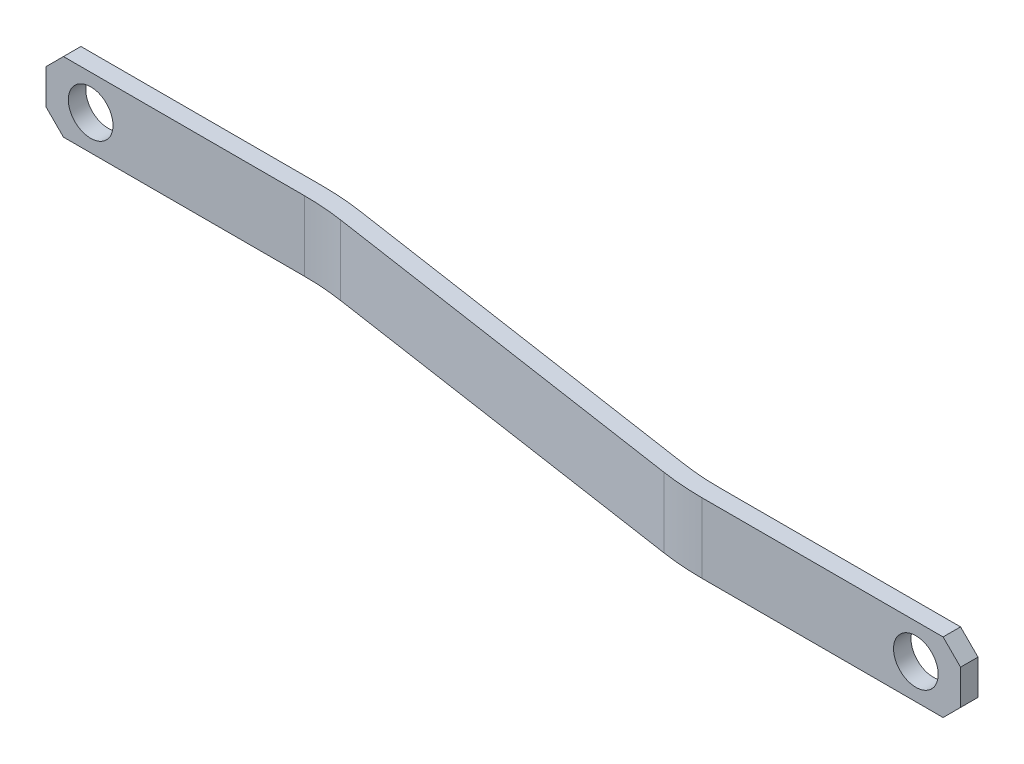
ISO-10303-21;
HEADER;
FILE_DESCRIPTION(('STEP AP214'),'2;1');
FILE_NAME('part.step','',(''),(''),'','','');
FILE_SCHEMA(('AUTOMOTIVE_DESIGN { 1 0 10303 214 1 1 1 1 }'));
ENDSEC;
DATA;
#1=APPLICATION_CONTEXT('core data for automotive mechanical design processes');
#2=APPLICATION_PROTOCOL_DEFINITION('international standard','automotive_design',2000,#1);
#3=PRODUCT_CONTEXT('',#1,'mechanical');
#4=PRODUCT('Part','Part','',(#3));
#5=PRODUCT_RELATED_PRODUCT_CATEGORY('part','',(#4));
#6=PRODUCT_DEFINITION_FORMATION('','',#4);
#7=PRODUCT_DEFINITION_CONTEXT('part definition',#1,'design');
#8=PRODUCT_DEFINITION('design','',#6,#7);
#9=PRODUCT_DEFINITION_SHAPE('','',#8);
#10=(LENGTH_UNIT() NAMED_UNIT(*) SI_UNIT(.MILLI.,.METRE.));
#11=(NAMED_UNIT(*) PLANE_ANGLE_UNIT() SI_UNIT($,.RADIAN.));
#12=(NAMED_UNIT(*) SI_UNIT($,.STERADIAN.) SOLID_ANGLE_UNIT());
#13=UNCERTAINTY_MEASURE_WITH_UNIT(LENGTH_MEASURE(1.E-05),#10,'distance_accuracy_value','');
#14=(GEOMETRIC_REPRESENTATION_CONTEXT(3) GLOBAL_UNCERTAINTY_ASSIGNED_CONTEXT((#13)) GLOBAL_UNIT_ASSIGNED_CONTEXT((#10,
#11,#12)) REPRESENTATION_CONTEXT('',''));
#15=CARTESIAN_POINT('',(0.,0.,0.));
#16=DIRECTION('',(0.,0.,1.));
#17=DIRECTION('',(1.,0.,0.));
#18=AXIS2_PLACEMENT_3D('',#15,#16,#17);
#19=CARTESIAN_POINT('',(47.0227665510806,-38.1,50.8));
#20=DIRECTION('',(0.,1.,0.));
#21=DIRECTION('',(-1.,0.,0.));
#22=AXIS2_PLACEMENT_3D('',#19,#20,#21);
#23=CYLINDRICAL_SURFACE('',#22,50.8);
#24=DIRECTION('',(0.,1.,0.));
#25=VECTOR('',#24,1.);
#26=CARTESIAN_POINT('',(54.5356969778409,-38.1,0.558623860381184));
#27=LINE('',#26,#25);
#28=CARTESIAN_POINT('',(54.5356969778409,0.,0.558623860381192));
#29=VERTEX_POINT('',#28);
#30=CARTESIAN_POINT('',(54.5356969778409,12.7,0.558623860381191));
#31=VERTEX_POINT('',#30);
#32=EDGE_CURVE('E265',#29,#31,#27,.T.);
#33=ORIENTED_EDGE('',*,*,#32,.F.);
#34=CARTESIAN_POINT('',(47.0227665510806,0.,50.8));
#35=DIRECTION('',(0.,1.,0.));
#36=DIRECTION('',(0.,0.,1.));
#37=AXIS2_PLACEMENT_3D('',#34,#35,#36);
#38=CIRCLE('',#37,50.8);
#39=CARTESIAN_POINT('',(47.0227665510806,0.,0.));
#40=VERTEX_POINT('',#39);
#41=EDGE_CURVE('E263',#29,#40,#38,.T.);
#42=ORIENTED_EDGE('',*,*,#41,.T.);
#43=DIRECTION('',(0.,1.,0.));
#44=VECTOR('',#43,1.);
#45=CARTESIAN_POINT('',(47.0227665510806,-38.1,0.));
#46=LINE('',#45,#44);
#47=CARTESIAN_POINT('',(47.0227665510806,12.7,0.));
#48=VERTEX_POINT('',#47);
#49=EDGE_CURVE('E184',#40,#48,#46,.T.);
#50=ORIENTED_EDGE('',*,*,#49,.T.);
#51=CARTESIAN_POINT('',(47.0227665510806,12.7,50.8));
#52=DIRECTION('',(0.,1.,0.));
#53=DIRECTION('',(1.,0.,0.));
#54=AXIS2_PLACEMENT_3D('',#51,#52,#53);
#55=CIRCLE('',#54,50.8);
#56=EDGE_CURVE('E230',#31,#48,#55,.T.);
#57=ORIENTED_EDGE('',*,*,#56,.F.);
#58=EDGE_LOOP('',(#33,#42,#50,#57));
#59=FACE_BOUND('',#58,.T.);
#60=ADVANCED_FACE('F41',(#59),#23,.T.);
#61=CARTESIAN_POINT('',(130.777233448919,-38.1,11.43));
#62=DIRECTION('',(0.,0.,-1.));
#63=DIRECTION('',(-1.,0.,0.));
#64=AXIS2_PLACEMENT_3D('',#61,#62,#63);
#65=PLANE('',#64);
#66=CARTESIAN_POINT('',(169.672,6.34999999999999,11.43));
#67=DIRECTION('',(0.,0.,1.));
#68=DIRECTION('',(1.,0.,0.));
#69=AXIS2_PLACEMENT_3D('',#66,#67,#68);
#70=CIRCLE('',#69,4.06399999999999);
#71=CARTESIAN_POINT('',(173.736,6.34999999999999,11.43));
#72=VERTEX_POINT('',#71);
#73=EDGE_CURVE('E301',#72,#72,#70,.T.);
#74=ORIENTED_EDGE('',*,*,#73,.T.);
#75=EDGE_LOOP('',(#74));
#76=FACE_BOUND('',#75,.T.);
#77=DIRECTION('',(-1.,0.,0.));
#78=VECTOR('',#77,1.);
#79=CARTESIAN_POINT('',(130.777233448919,12.7,11.43));
#80=LINE('',#79,#78);
#81=CARTESIAN_POINT('',(174.625,12.7,11.43));
#82=VERTEX_POINT('',#81);
#83=CARTESIAN_POINT('',(130.777233448919,12.7,11.43));
#84=VERTEX_POINT('',#83);
#85=EDGE_CURVE('E178',#82,#84,#80,.T.);
#86=ORIENTED_EDGE('',*,*,#85,.F.);
#87=DIRECTION('',(0.707106781186553,-0.707106781186542,0.));
#88=VECTOR('',#87,1.);
#89=CARTESIAN_POINT('',(178.101116724459,9.22388327554063,11.43));
#90=LINE('',#89,#88);
#91=CARTESIAN_POINT('',(177.8,9.52499999999996,11.43));
#92=VERTEX_POINT('',#91);
#93=EDGE_CURVE('E194',#82,#92,#90,.T.);
#94=ORIENTED_EDGE('',*,*,#93,.T.);
#95=DIRECTION('',(0.,1.,0.));
#96=VECTOR('',#95,1.);
#97=CARTESIAN_POINT('',(177.8,-38.1,11.43));
#98=LINE('',#97,#96);
#99=CARTESIAN_POINT('',(177.8,3.17500000000003,11.43));
#100=VERTEX_POINT('',#99);
#101=EDGE_CURVE('E273',#100,#92,#98,.T.);
#102=ORIENTED_EDGE('',*,*,#101,.F.);
#103=DIRECTION('',(-0.707106781186555,-0.70710678118654,0.));
#104=VECTOR('',#103,1.);
#105=CARTESIAN_POINT('',(133.651116724459,-40.9738832755398,11.43));
#106=LINE('',#105,#104);
#107=CARTESIAN_POINT('',(174.625,0.,11.43));
#108=VERTEX_POINT('',#107);
#109=EDGE_CURVE('E186',#100,#108,#106,.T.);
#110=ORIENTED_EDGE('',*,*,#109,.T.);
#111=DIRECTION('',(-1.,0.,0.));
#112=VECTOR('',#111,1.);
#113=CARTESIAN_POINT('',(0.,0.,11.43));
#114=LINE('',#113,#112);
#115=CARTESIAN_POINT('',(130.777233448919,0.,11.43));
#116=VERTEX_POINT('',#115);
#117=EDGE_CURVE('E252',#108,#116,#114,.T.);
#118=ORIENTED_EDGE('',*,*,#117,.T.);
#119=DIRECTION('',(0.,1.,0.));
#120=VECTOR('',#119,1.);
#121=CARTESIAN_POINT('',(130.777233448919,-38.1,11.43));
#122=LINE('',#121,#120);
#123=EDGE_CURVE('E276',#116,#84,#122,.T.);
#124=ORIENTED_EDGE('',*,*,#123,.T.);
#125=EDGE_LOOP('',(#86,#94,#102,#110,#118,#124));
#126=FACE_BOUND('',#125,.T.);
#127=ADVANCED_FACE('F325',(#76,#126),#65,.T.);
#128=CARTESIAN_POINT('',(130.777233448919,-38.1,-36.195));
#129=DIRECTION('',(0.,1.,0.));
#130=DIRECTION('',(-1.,0.,0.));
#131=AXIS2_PLACEMENT_3D('',#128,#129,#130);
#132=CYLINDRICAL_SURFACE('',#131,47.625);
#133=ORIENTED_EDGE('',*,*,#123,.F.);
#134=CARTESIAN_POINT('',(130.777233448919,0.,-36.195));
#135=DIRECTION('',(0.,1.,0.));
#136=DIRECTION('',(0.,0.,1.));
#137=AXIS2_PLACEMENT_3D('',#134,#135,#136);
#138=CIRCLE('',#137,47.625);
#139=CARTESIAN_POINT('',(123.733861173832,0.,10.9062901308926));
#140=VERTEX_POINT('',#139);
#141=EDGE_CURVE('E249',#116,#140,#138,.F.);
#142=ORIENTED_EDGE('',*,*,#141,.T.);
#143=DIRECTION('',(0.,1.,0.));
#144=VECTOR('',#143,1.);
#145=CARTESIAN_POINT('',(123.733861173832,-38.1,10.9062901308926));
#146=LINE('',#145,#144);
#147=CARTESIAN_POINT('',(123.733861173832,12.7,10.9062901308926));
#148=VERTEX_POINT('',#147);
#149=EDGE_CURVE('E279',#140,#148,#146,.T.);
#150=ORIENTED_EDGE('',*,*,#149,.T.);
#151=CARTESIAN_POINT('',(130.777233448919,12.7,-36.195));
#152=DIRECTION('',(0.,-1.,0.));
#153=DIRECTION('',(-1.,0.,0.));
#154=AXIS2_PLACEMENT_3D('',#151,#152,#153);
#155=CIRCLE('',#154,47.625);
#156=EDGE_CURVE('E287',#84,#148,#155,.T.);
#157=ORIENTED_EDGE('',*,*,#156,.F.);
#158=EDGE_LOOP('',(#133,#142,#150,#157));
#159=FACE_BOUND('',#158,.T.);
#160=ADVANCED_FACE('F331',(#159),#132,.F.);
#161=CARTESIAN_POINT('',(54.5356969778409,-38.1,0.558623860381191));
#162=DIRECTION('',(0.147892331235438,0.,-0.989003467315331));
#163=DIRECTION('',(-0.989003467315331,0.,-0.147892331235438));
#164=AXIS2_PLACEMENT_3D('',#161,#162,#163);
#165=PLANE('',#164);
#166=ORIENTED_EDGE('',*,*,#149,.F.);
#167=DIRECTION('',(-0.989003467315331,0.,-0.147892331235438));
#168=VECTOR('',#167,1.);
#169=CARTESIAN_POINT('',(3.24732013973059,0.,-7.11087161313806));
#170=LINE('',#169,#168);
#171=EDGE_CURVE('E241',#140,#29,#170,.T.);
#172=ORIENTED_EDGE('',*,*,#171,.T.);
#173=ORIENTED_EDGE('',*,*,#32,.T.);
#174=DIRECTION('',(-0.989003467315331,0.,-0.147892331235438));
#175=VECTOR('',#174,1.);
#176=CARTESIAN_POINT('',(54.5356969778409,12.7,0.558623860381191));
#177=LINE('',#176,#175);
#178=EDGE_CURVE('E285',#148,#31,#177,.T.);
#179=ORIENTED_EDGE('',*,*,#178,.F.);
#180=EDGE_LOOP('',(#166,#172,#173,#179));
#181=FACE_BOUND('',#180,.T.);
#182=ADVANCED_FACE('F339',(#181),#165,.T.);
#183=CARTESIAN_POINT('',(0.,0.,0.));
#184=DIRECTION('',(0.,0.,-1.));
#185=DIRECTION('',(-1.,0.,0.));
#186=AXIS2_PLACEMENT_3D('',#183,#184,#185);
#187=PLANE('',#186);
#188=CARTESIAN_POINT('',(8.128,6.35,0.));
#189=DIRECTION('',(0.,0.,1.));
#190=DIRECTION('',(1.,0.,0.));
#191=AXIS2_PLACEMENT_3D('',#188,#189,#190);
#192=CIRCLE('',#191,4.064);
#193=CARTESIAN_POINT('',(12.192,6.35,0.));
#194=VERTEX_POINT('',#193);
#195=EDGE_CURVE('E294',#194,#194,#192,.T.);
#196=ORIENTED_EDGE('',*,*,#195,.T.);
#197=EDGE_LOOP('',(#196));
#198=FACE_BOUND('',#197,.T.);
#199=DIRECTION('',(0.,1.,0.));
#200=VECTOR('',#199,1.);
#201=CARTESIAN_POINT('',(0.,0.,0.));
#202=LINE('',#201,#200);
#203=CARTESIAN_POINT('',(0.,3.17500000000002,0.));
#204=VERTEX_POINT('',#203);
#205=CARTESIAN_POINT('',(0.,9.52499999999998,0.));
#206=VERTEX_POINT('',#205);
#207=EDGE_CURVE('E238',#204,#206,#202,.T.);
#208=ORIENTED_EDGE('',*,*,#207,.T.);
#209=DIRECTION('',(0.707106781186556,0.707106781186539,0.));
#210=VECTOR('',#209,1.);
#211=CARTESIAN_POINT('',(-4.76249999999999,4.7625000000001,0.));
#212=LINE('',#211,#210);
#213=CARTESIAN_POINT('',(3.17500000000009,12.7,0.));
#214=VERTEX_POINT('',#213);
#215=EDGE_CURVE('E213',#206,#214,#212,.T.);
#216=ORIENTED_EDGE('',*,*,#215,.T.);
#217=DIRECTION('',(-1.,0.,0.));
#218=VECTOR('',#217,1.);
#219=CARTESIAN_POINT('',(177.8,12.7,0.));
#220=LINE('',#219,#218);
#221=EDGE_CURVE('E236',#48,#214,#220,.T.);
#222=ORIENTED_EDGE('',*,*,#221,.F.);
#223=ORIENTED_EDGE('',*,*,#49,.F.);
#224=DIRECTION('',(1.,0.,0.));
#225=VECTOR('',#224,1.);
#226=CARTESIAN_POINT('',(0.,0.,0.));
#227=LINE('',#226,#225);
#228=CARTESIAN_POINT('',(3.17500000000005,0.,0.));
#229=VERTEX_POINT('',#228);
#230=EDGE_CURVE('E168',#229,#40,#227,.T.);
#231=ORIENTED_EDGE('',*,*,#230,.F.);
#232=DIRECTION('',(-0.707106781186551,0.707106781186544,0.));
#233=VECTOR('',#232,1.);
#234=CARTESIAN_POINT('',(1.58750000000001,1.58750000000003,0.));
#235=LINE('',#234,#233);
#236=EDGE_CURVE('E211',#229,#204,#235,.T.);
#237=ORIENTED_EDGE('',*,*,#236,.T.);
#238=EDGE_LOOP('',(#208,#216,#222,#223,#231,#237));
#239=FACE_BOUND('',#238,.T.);
#240=ADVANCED_FACE('F234',(#198,#239),#187,.T.);
#241=CARTESIAN_POINT('',(0.,0.,14.605));
#242=DIRECTION('',(-1.,0.,0.));
#243=DIRECTION('',(0.,0.,1.));
#244=AXIS2_PLACEMENT_3D('',#241,#242,#243);
#245=PLANE('',#244);
#246=DIRECTION('',(0.,1.,0.));
#247=VECTOR('',#246,1.);
#248=CARTESIAN_POINT('',(0.,-38.1,3.175));
#249=LINE('',#248,#247);
#250=CARTESIAN_POINT('',(0.,3.17500000000003,3.175));
#251=VERTEX_POINT('',#250);
#252=CARTESIAN_POINT('',(0.,9.52499999999998,3.175));
#253=VERTEX_POINT('',#252);
#254=EDGE_CURVE('E219',#251,#253,#249,.T.);
#255=ORIENTED_EDGE('',*,*,#254,.T.);
#256=DIRECTION('',(0.,0.,-1.));
#257=VECTOR('',#256,1.);
#258=CARTESIAN_POINT('',(0.,9.52499999999998,0.));
#259=LINE('',#258,#257);
#260=EDGE_CURVE('E208',#253,#206,#259,.T.);
#261=ORIENTED_EDGE('',*,*,#260,.T.);
#262=ORIENTED_EDGE('',*,*,#207,.F.);
#263=DIRECTION('',(0.,0.,1.));
#264=VECTOR('',#263,1.);
#265=CARTESIAN_POINT('',(0.,3.17500000000002,3.175));
#266=LINE('',#265,#264);
#267=EDGE_CURVE('E206',#204,#251,#266,.T.);
#268=ORIENTED_EDGE('',*,*,#267,.T.);
#269=EDGE_LOOP('',(#255,#261,#262,#268));
#270=FACE_BOUND('',#269,.T.);
#271=ADVANCED_FACE('F225',(#270),#245,.T.);
#272=CARTESIAN_POINT('',(0.,0.,14.605));
#273=DIRECTION('',(0.,1.,0.));
#274=DIRECTION('',(0.,0.,1.));
#275=AXIS2_PLACEMENT_3D('',#272,#273,#274);
#276=PLANE('',#275);
#277=DIRECTION('',(1.,0.,0.));
#278=VECTOR('',#277,1.);
#279=CARTESIAN_POINT('',(0.,0.,3.175));
#280=LINE('',#279,#278);
#281=CARTESIAN_POINT('',(3.17500000000005,0.,3.175));
#282=VERTEX_POINT('',#281);
#283=CARTESIAN_POINT('',(47.0227665510805,0.,3.17499999999999));
#284=VERTEX_POINT('',#283);
#285=EDGE_CURVE('E260',#282,#284,#280,.T.);
#286=ORIENTED_EDGE('',*,*,#285,.F.);
#287=DIRECTION('',(0.,0.,-1.));
#288=VECTOR('',#287,1.);
#289=CARTESIAN_POINT('',(3.17500000000005,0.,0.));
#290=LINE('',#289,#288);
#291=EDGE_CURVE('E11',#282,#229,#290,.T.);
#292=ORIENTED_EDGE('',*,*,#291,.T.);
#293=ORIENTED_EDGE('',*,*,#230,.T.);
#294=ORIENTED_EDGE('',*,*,#41,.F.);
#295=ORIENTED_EDGE('',*,*,#171,.F.);
#296=ORIENTED_EDGE('',*,*,#141,.F.);
#297=ORIENTED_EDGE('',*,*,#117,.F.);
#298=DIRECTION('',(0.,0.,1.));
#299=VECTOR('',#298,1.);
#300=CARTESIAN_POINT('',(174.625,0.,14.605));
#301=LINE('',#300,#299);
#302=CARTESIAN_POINT('',(174.625,0.,14.605));
#303=VERTEX_POINT('',#302);
#304=EDGE_CURVE('E204',#108,#303,#301,.T.);
#305=ORIENTED_EDGE('',*,*,#304,.T.);
#306=DIRECTION('',(1.,0.,0.));
#307=VECTOR('',#306,1.);
#308=CARTESIAN_POINT('',(0.,0.,14.605));
#309=LINE('',#308,#307);
#310=CARTESIAN_POINT('',(130.777233448919,0.,14.605));
#311=VERTEX_POINT('',#310);
#312=EDGE_CURVE('E189',#311,#303,#309,.T.);
#313=ORIENTED_EDGE('',*,*,#312,.F.);
#314=CARTESIAN_POINT('',(130.777233448919,0.,-36.195));
#315=DIRECTION('',(0.,1.,0.));
#316=DIRECTION('',(0.,0.,1.));
#317=AXIS2_PLACEMENT_3D('',#314,#315,#316);
#318=CIRCLE('',#317,50.8);
#319=CARTESIAN_POINT('',(123.264303022159,0.,14.0463761396188));
#320=VERTEX_POINT('',#319);
#321=EDGE_CURVE('E182',#320,#311,#318,.T.);
#322=ORIENTED_EDGE('',*,*,#321,.F.);
#323=DIRECTION('',(0.989003467315331,0.,0.147892331235439));
#324=VECTOR('',#323,1.);
#325=CARTESIAN_POINT('',(2.77776198805809,0.,-3.97078560441192));
#326=LINE('',#325,#324);
#327=CARTESIAN_POINT('',(54.0661388261683,0.,3.69870986910734));
#328=VERTEX_POINT('',#327);
#329=EDGE_CURVE('E254',#328,#320,#326,.T.);
#330=ORIENTED_EDGE('',*,*,#329,.F.);
#331=CARTESIAN_POINT('',(47.0227665510805,0.,50.8));
#332=DIRECTION('',(0.,1.,0.));
#333=DIRECTION('',(0.,0.,1.));
#334=AXIS2_PLACEMENT_3D('',#331,#332,#333);
#335=CIRCLE('',#334,47.625);
#336=EDGE_CURVE('E257',#284,#328,#335,.F.);
#337=ORIENTED_EDGE('',*,*,#336,.F.);
#338=EDGE_LOOP('',(#286,#292,#293,#294,#295,#296,#297,#305,#313,#322,#330,#337));
#339=FACE_BOUND('',#338,.T.);
#340=ADVANCED_FACE('F368',(#339),#276,.F.);
#341=CARTESIAN_POINT('',(177.8,12.7,14.605));
#342=DIRECTION('',(1.,0.,0.));
#343=DIRECTION('',(0.,0.,-1.));
#344=AXIS2_PLACEMENT_3D('',#341,#342,#343);
#345=PLANE('',#344);
#346=ORIENTED_EDGE('',*,*,#101,.T.);
#347=DIRECTION('',(0.,0.,1.));
#348=VECTOR('',#347,1.);
#349=CARTESIAN_POINT('',(177.8,9.52499999999996,14.605));
#350=LINE('',#349,#348);
#351=CARTESIAN_POINT('',(177.8,9.52499999999996,14.605));
#352=VERTEX_POINT('',#351);
#353=EDGE_CURVE('E199',#92,#352,#350,.T.);
#354=ORIENTED_EDGE('',*,*,#353,.T.);
#355=DIRECTION('',(0.,-1.,0.));
#356=VECTOR('',#355,1.);
#357=CARTESIAN_POINT('',(177.8,12.7,14.605));
#358=LINE('',#357,#356);
#359=CARTESIAN_POINT('',(177.8,3.17500000000002,14.605));
#360=VERTEX_POINT('',#359);
#361=EDGE_CURVE('E167',#352,#360,#358,.T.);
#362=ORIENTED_EDGE('',*,*,#361,.T.);
#363=DIRECTION('',(0.,0.,-1.));
#364=VECTOR('',#363,1.);
#365=CARTESIAN_POINT('',(177.8,3.17500000000002,11.43));
#366=LINE('',#365,#364);
#367=EDGE_CURVE('E196',#360,#100,#366,.T.);
#368=ORIENTED_EDGE('',*,*,#367,.T.);
#369=EDGE_LOOP('',(#346,#354,#362,#368));
#370=FACE_BOUND('',#369,.T.);
#371=ADVANCED_FACE('F320',(#370),#345,.T.);
#372=CARTESIAN_POINT('',(177.8,12.7,14.605));
#373=DIRECTION('',(0.,-1.,0.));
#374=DIRECTION('',(1.,0.,0.));
#375=AXIS2_PLACEMENT_3D('',#372,#373,#374);
#376=PLANE('',#375);
#377=ORIENTED_EDGE('',*,*,#221,.T.);
#378=DIRECTION('',(0.,0.,1.));
#379=VECTOR('',#378,1.);
#380=CARTESIAN_POINT('',(3.17500000000009,12.7,3.175));
#381=LINE('',#380,#379);
#382=CARTESIAN_POINT('',(3.17500000000009,12.7,3.175));
#383=VERTEX_POINT('',#382);
#384=EDGE_CURVE('E64',#214,#383,#381,.T.);
#385=ORIENTED_EDGE('',*,*,#384,.T.);
#386=DIRECTION('',(1.,0.,0.));
#387=VECTOR('',#386,1.);
#388=CARTESIAN_POINT('',(0.,12.7,3.175));
#389=LINE('',#388,#387);
#390=CARTESIAN_POINT('',(47.0227665510805,12.7,3.17499999999999));
#391=VERTEX_POINT('',#390);
#392=EDGE_CURVE('E221',#383,#391,#389,.T.);
#393=ORIENTED_EDGE('',*,*,#392,.T.);
#394=CARTESIAN_POINT('',(47.0227665510805,12.7,50.8));
#395=DIRECTION('',(0.,-1.,0.));
#396=DIRECTION('',(1.,0.,0.));
#397=AXIS2_PLACEMENT_3D('',#394,#395,#396);
#398=CIRCLE('',#397,47.625);
#399=CARTESIAN_POINT('',(54.0661388261683,12.7,3.69870986910734));
#400=VERTEX_POINT('',#399);
#401=EDGE_CURVE('E291',#391,#400,#398,.T.);
#402=ORIENTED_EDGE('',*,*,#401,.T.);
#403=DIRECTION('',(0.989003467315331,0.,0.147892331235439));
#404=VECTOR('',#403,1.);
#405=CARTESIAN_POINT('',(54.0661388261683,12.7,3.69870986910734));
#406=LINE('',#405,#404);
#407=CARTESIAN_POINT('',(123.264303022159,12.7,14.0463761396188));
#408=VERTEX_POINT('',#407);
#409=EDGE_CURVE('E174',#400,#408,#406,.T.);
#410=ORIENTED_EDGE('',*,*,#409,.T.);
#411=CARTESIAN_POINT('',(130.777233448919,12.7,-36.195));
#412=DIRECTION('',(0.,1.,0.));
#413=DIRECTION('',(-1.,0.,0.));
#414=AXIS2_PLACEMENT_3D('',#411,#412,#413);
#415=CIRCLE('',#414,50.8);
#416=CARTESIAN_POINT('',(130.777233448919,12.7,14.605));
#417=VERTEX_POINT('',#416);
#418=EDGE_CURVE('E171',#408,#417,#415,.T.);
#419=ORIENTED_EDGE('',*,*,#418,.T.);
#420=DIRECTION('',(-1.,0.,0.));
#421=VECTOR('',#420,1.);
#422=CARTESIAN_POINT('',(177.8,12.7,14.605));
#423=LINE('',#422,#421);
#424=CARTESIAN_POINT('',(174.625,12.7,14.605));
#425=VERTEX_POINT('',#424);
#426=EDGE_CURVE('E155',#425,#417,#423,.T.);
#427=ORIENTED_EDGE('',*,*,#426,.F.);
#428=DIRECTION('',(0.,0.,-1.));
#429=VECTOR('',#428,1.);
#430=CARTESIAN_POINT('',(174.625,12.7,11.43));
#431=LINE('',#430,#429);
#432=EDGE_CURVE('E183',#425,#82,#431,.T.);
#433=ORIENTED_EDGE('',*,*,#432,.T.);
#434=ORIENTED_EDGE('',*,*,#85,.T.);
#435=ORIENTED_EDGE('',*,*,#156,.T.);
#436=ORIENTED_EDGE('',*,*,#178,.T.);
#437=ORIENTED_EDGE('',*,*,#56,.T.);
#438=EDGE_LOOP('',(#377,#385,#393,#402,#410,#419,#427,#433,#434,#435,#436,#437));
#439=FACE_BOUND('',#438,.T.);
#440=ADVANCED_FACE('F172',(#439),#376,.F.);
#441=CARTESIAN_POINT('',(0.,0.,14.605));
#442=DIRECTION('',(0.,0.,-1.));
#443=DIRECTION('',(-1.,0.,0.));
#444=AXIS2_PLACEMENT_3D('',#441,#442,#443);
#445=PLANE('',#444);
#446=CARTESIAN_POINT('',(169.672,6.34999999999999,14.605));
#447=DIRECTION('',(0.,0.,1.));
#448=DIRECTION('',(1.,0.,0.));
#449=AXIS2_PLACEMENT_3D('',#446,#447,#448);
#450=CIRCLE('',#449,4.06399999999999);
#451=CARTESIAN_POINT('',(173.736,6.34999999999999,14.605));
#452=VERTEX_POINT('',#451);
#453=EDGE_CURVE('E298',#452,#452,#450,.T.);
#454=ORIENTED_EDGE('',*,*,#453,.F.);
#455=EDGE_LOOP('',(#454));
#456=FACE_BOUND('',#455,.T.);
#457=ORIENTED_EDGE('',*,*,#361,.F.);
#458=DIRECTION('',(-0.707106781186553,0.707106781186542,0.));
#459=VECTOR('',#458,1.);
#460=CARTESIAN_POINT('',(174.625,12.7,14.605));
#461=LINE('',#460,#459);
#462=EDGE_CURVE('E164',#352,#425,#461,.T.);
#463=ORIENTED_EDGE('',*,*,#462,.T.);
#464=ORIENTED_EDGE('',*,*,#426,.T.);
#465=DIRECTION('',(0.,1.,0.));
#466=VECTOR('',#465,1.);
#467=CARTESIAN_POINT('',(130.777233448919,-38.1,14.605));
#468=LINE('',#467,#466);
#469=EDGE_CURVE('E161',#311,#417,#468,.T.);
#470=ORIENTED_EDGE('',*,*,#469,.F.);
#471=ORIENTED_EDGE('',*,*,#312,.T.);
#472=DIRECTION('',(0.707106781186555,0.70710678118654,0.));
#473=VECTOR('',#472,1.);
#474=CARTESIAN_POINT('',(177.8,3.17500000000002,14.605));
#475=LINE('',#474,#473);
#476=EDGE_CURVE('E201',#303,#360,#475,.T.);
#477=ORIENTED_EDGE('',*,*,#476,.T.);
#478=EDGE_LOOP('',(#457,#463,#464,#470,#471,#477));
#479=FACE_BOUND('',#478,.T.);
#480=ADVANCED_FACE('F158',(#456,#479),#445,.F.);
#481=CARTESIAN_POINT('',(54.0661388261683,-38.1,3.69870986910734));
#482=DIRECTION('',(-0.147892331235439,0.,0.989003467315331));
#483=DIRECTION('',(0.989003467315331,0.,0.147892331235439));
#484=AXIS2_PLACEMENT_3D('',#481,#482,#483);
#485=PLANE('',#484);
#486=DIRECTION('',(0.,1.,0.));
#487=VECTOR('',#486,1.);
#488=CARTESIAN_POINT('',(54.0661388261683,-38.1,3.69870986910734));
#489=LINE('',#488,#487);
#490=EDGE_CURVE('E268',#328,#400,#489,.T.);
#491=ORIENTED_EDGE('',*,*,#490,.F.);
#492=ORIENTED_EDGE('',*,*,#329,.T.);
#493=DIRECTION('',(0.,1.,0.));
#494=VECTOR('',#493,1.);
#495=CARTESIAN_POINT('',(123.264303022159,-38.1,14.0463761396188));
#496=LINE('',#495,#494);
#497=EDGE_CURVE('E271',#320,#408,#496,.T.);
#498=ORIENTED_EDGE('',*,*,#497,.T.);
#499=ORIENTED_EDGE('',*,*,#409,.F.);
#500=EDGE_LOOP('',(#491,#492,#498,#499));
#501=FACE_BOUND('',#500,.T.);
#502=ADVANCED_FACE('F311',(#501),#485,.T.);
#503=CARTESIAN_POINT('',(47.0227665510805,-38.1,50.8));
#504=DIRECTION('',(0.,1.,0.));
#505=DIRECTION('',(-1.,0.,0.));
#506=AXIS2_PLACEMENT_3D('',#503,#504,#505);
#507=CYLINDRICAL_SURFACE('',#506,47.625);
#508=DIRECTION('',(0.,1.,0.));
#509=VECTOR('',#508,1.);
#510=CARTESIAN_POINT('',(47.0227665510805,-38.1,3.17499999999999));
#511=LINE('',#510,#509);
#512=EDGE_CURVE('E229',#284,#391,#511,.T.);
#513=ORIENTED_EDGE('',*,*,#512,.F.);
#514=ORIENTED_EDGE('',*,*,#336,.T.);
#515=ORIENTED_EDGE('',*,*,#490,.T.);
#516=ORIENTED_EDGE('',*,*,#401,.F.);
#517=EDGE_LOOP('',(#513,#514,#515,#516));
#518=FACE_BOUND('',#517,.T.);
#519=ADVANCED_FACE('F317',(#518),#507,.F.);
#520=CARTESIAN_POINT('',(0.,-38.1,3.175));
#521=DIRECTION('',(0.,0.,1.));
#522=DIRECTION('',(1.,0.,0.));
#523=AXIS2_PLACEMENT_3D('',#520,#521,#522);
#524=PLANE('',#523);
#525=CARTESIAN_POINT('',(8.128,6.35,3.175));
#526=DIRECTION('',(0.,0.,1.));
#527=DIRECTION('',(1.,0.,0.));
#528=AXIS2_PLACEMENT_3D('',#525,#526,#527);
#529=CIRCLE('',#528,4.064);
#530=CARTESIAN_POINT('',(12.192,6.35,3.175));
#531=VERTEX_POINT('',#530);
#532=EDGE_CURVE('E295',#531,#531,#529,.T.);
#533=ORIENTED_EDGE('',*,*,#532,.F.);
#534=EDGE_LOOP('',(#533));
#535=FACE_BOUND('',#534,.T.);
#536=ORIENTED_EDGE('',*,*,#392,.F.);
#537=DIRECTION('',(-0.707106781186556,-0.707106781186539,0.));
#538=VECTOR('',#537,1.);
#539=CARTESIAN_POINT('',(-23.8125,-14.2874999999995,3.175));
#540=LINE('',#539,#538);
#541=EDGE_CURVE('E49',#383,#253,#540,.T.);
#542=ORIENTED_EDGE('',*,*,#541,.T.);
#543=ORIENTED_EDGE('',*,*,#254,.F.);
#544=DIRECTION('',(0.707106781186551,-0.707106781186544,0.));
#545=VECTOR('',#544,1.);
#546=CARTESIAN_POINT('',(20.6375,-17.4624999999998,3.175));
#547=LINE('',#546,#545);
#548=EDGE_CURVE('E56',#251,#282,#547,.T.);
#549=ORIENTED_EDGE('',*,*,#548,.T.);
#550=ORIENTED_EDGE('',*,*,#285,.T.);
#551=ORIENTED_EDGE('',*,*,#512,.T.);
#552=EDGE_LOOP('',(#536,#542,#543,#549,#550,#551));
#553=FACE_BOUND('',#552,.T.);
#554=ADVANCED_FACE('F218',(#535,#553),#524,.T.);
#555=CARTESIAN_POINT('',(130.777233448919,-38.1,-36.195));
#556=DIRECTION('',(0.,1.,0.));
#557=DIRECTION('',(-1.,0.,0.));
#558=AXIS2_PLACEMENT_3D('',#555,#556,#557);
#559=CYLINDRICAL_SURFACE('',#558,50.8);
#560=ORIENTED_EDGE('',*,*,#497,.F.);
#561=ORIENTED_EDGE('',*,*,#321,.T.);
#562=ORIENTED_EDGE('',*,*,#469,.T.);
#563=ORIENTED_EDGE('',*,*,#418,.F.);
#564=EDGE_LOOP('',(#560,#561,#562,#563));
#565=FACE_BOUND('',#564,.T.);
#566=ADVANCED_FACE('F181',(#565),#559,.T.);
#567=CARTESIAN_POINT('',(8.128,6.35,0.));
#568=DIRECTION('',(0.,0.,1.));
#569=DIRECTION('',(1.,0.,0.));
#570=AXIS2_PLACEMENT_3D('',#567,#568,#569);
#571=CYLINDRICAL_SURFACE('',#570,4.064);
#572=ORIENTED_EDGE('',*,*,#195,.F.);
#573=EDGE_LOOP('',(#572));
#574=FACE_BOUND('',#573,.T.);
#575=ORIENTED_EDGE('',*,*,#532,.T.);
#576=EDGE_LOOP('',(#575));
#577=FACE_BOUND('',#576,.T.);
#578=ADVANCED_FACE('F337',(#574,#577),#571,.F.);
#579=CARTESIAN_POINT('',(169.672,6.34999999999999,14.605));
#580=DIRECTION('',(0.,0.,-1.));
#581=DIRECTION('',(-1.,0.,0.));
#582=AXIS2_PLACEMENT_3D('',#579,#580,#581);
#583=CYLINDRICAL_SURFACE('',#582,4.06399999999999);
#584=ORIENTED_EDGE('',*,*,#453,.T.);
#585=EDGE_LOOP('',(#584));
#586=FACE_BOUND('',#585,.T.);
#587=ORIENTED_EDGE('',*,*,#73,.F.);
#588=EDGE_LOOP('',(#587));
#589=FACE_BOUND('',#588,.T.);
#590=ADVANCED_FACE('F307',(#586,#589),#583,.F.);
#591=CARTESIAN_POINT('',(174.625,12.7,14.605));
#592=DIRECTION('',(0.707106781186542,0.707106781186553,0.));
#593=DIRECTION('',(-0.707106781186553,0.707106781186542,0.));
#594=AXIS2_PLACEMENT_3D('',#591,#592,#593);
#595=PLANE('',#594);
#596=ORIENTED_EDGE('',*,*,#462,.F.);
#597=ORIENTED_EDGE('',*,*,#353,.F.);
#598=ORIENTED_EDGE('',*,*,#93,.F.);
#599=ORIENTED_EDGE('',*,*,#432,.F.);
#600=EDGE_LOOP('',(#596,#597,#598,#599));
#601=FACE_BOUND('',#600,.T.);
#602=ADVANCED_FACE('F361',(#601),#595,.T.);
#603=CARTESIAN_POINT('',(177.8,3.17500000000002,14.605));
#604=DIRECTION('',(0.70710678118654,-0.707106781186555,0.));
#605=DIRECTION('',(0.707106781186555,0.70710678118654,0.));
#606=AXIS2_PLACEMENT_3D('',#603,#604,#605);
#607=PLANE('',#606);
#608=ORIENTED_EDGE('',*,*,#476,.F.);
#609=ORIENTED_EDGE('',*,*,#304,.F.);
#610=ORIENTED_EDGE('',*,*,#109,.F.);
#611=ORIENTED_EDGE('',*,*,#367,.F.);
#612=EDGE_LOOP('',(#608,#609,#610,#611));
#613=FACE_BOUND('',#612,.T.);
#614=ADVANCED_FACE('F379',(#613),#607,.T.);
#615=CARTESIAN_POINT('',(0.,9.52499999999998,14.605));
#616=DIRECTION('',(-0.707106781186539,0.707106781186556,0.));
#617=DIRECTION('',(-0.707106781186556,-0.707106781186539,0.));
#618=AXIS2_PLACEMENT_3D('',#615,#616,#617);
#619=PLANE('',#618);
#620=ORIENTED_EDGE('',*,*,#541,.F.);
#621=ORIENTED_EDGE('',*,*,#384,.F.);
#622=ORIENTED_EDGE('',*,*,#215,.F.);
#623=ORIENTED_EDGE('',*,*,#260,.F.);
#624=EDGE_LOOP('',(#620,#621,#622,#623));
#625=FACE_BOUND('',#624,.T.);
#626=ADVANCED_FACE('F232',(#625),#619,.T.);
#627=CARTESIAN_POINT('',(3.17500000000005,0.,14.605));
#628=DIRECTION('',(-0.707106781186544,-0.707106781186551,0.));
#629=DIRECTION('',(0.707106781186551,-0.707106781186544,0.));
#630=AXIS2_PLACEMENT_3D('',#627,#628,#629);
#631=PLANE('',#630);
#632=ORIENTED_EDGE('',*,*,#548,.F.);
#633=ORIENTED_EDGE('',*,*,#267,.F.);
#634=ORIENTED_EDGE('',*,*,#236,.F.);
#635=ORIENTED_EDGE('',*,*,#291,.F.);
#636=EDGE_LOOP('',(#632,#633,#634,#635));
#637=FACE_BOUND('',#636,.T.);
#638=ADVANCED_FACE('F43',(#637),#631,.T.);
#639=CLOSED_SHELL('',(#60,#127,#160,#182,#240,#271,#340,#371,#440,#480,#502,#519,#554,#566,#578,
#590,#602,#614,#626,#638));
#640=MANIFOLD_SOLID_BREP('B2',#639);
#641=ADVANCED_BREP_SHAPE_REPRESENTATION('',(#18,#640),#14);
#642=SHAPE_DEFINITION_REPRESENTATION(#9,#641);
ENDSEC;
END-ISO-10303-21;
